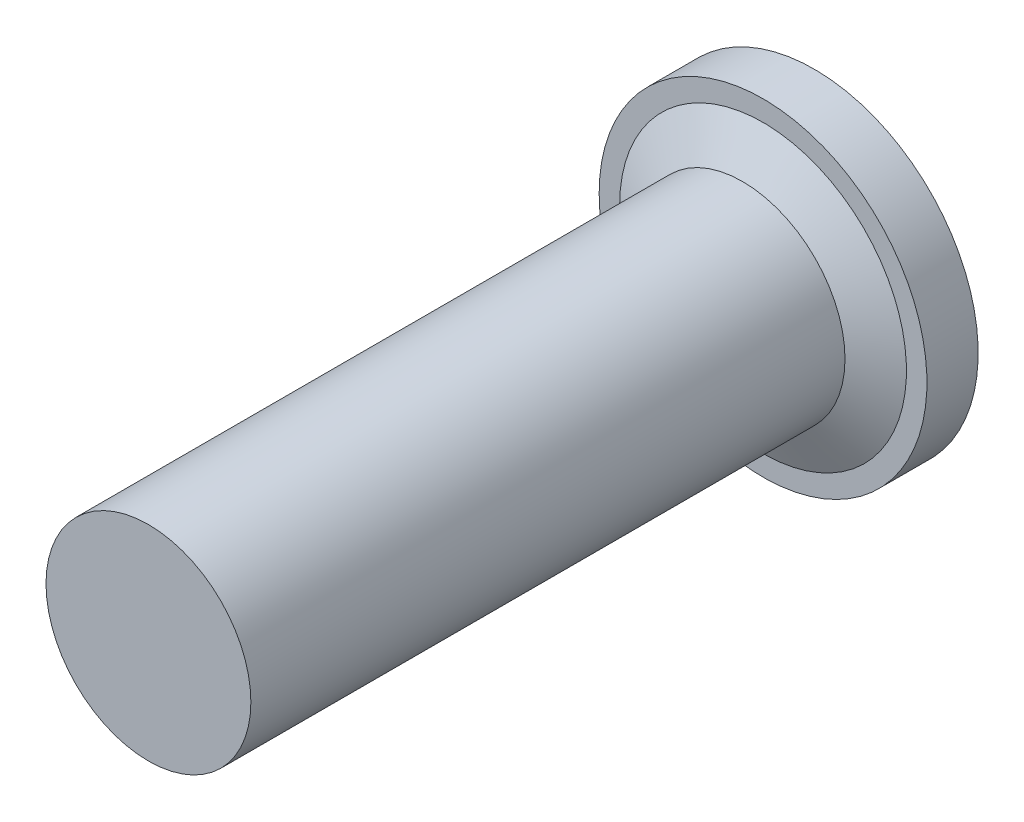
ISO-10303-21;
HEADER;
FILE_DESCRIPTION(('STEP AP214'),'2;1');
FILE_NAME('part.step','',(''),(''),'','','');
FILE_SCHEMA(('AUTOMOTIVE_DESIGN { 1 0 10303 214 1 1 1 1 }'));
ENDSEC;
DATA;
#1=APPLICATION_CONTEXT('core data for automotive mechanical design processes');
#2=APPLICATION_PROTOCOL_DEFINITION('international standard','automotive_design',2000,#1);
#3=PRODUCT_CONTEXT('',#1,'mechanical');
#4=PRODUCT('Part','Part','',(#3));
#5=PRODUCT_RELATED_PRODUCT_CATEGORY('part','',(#4));
#6=PRODUCT_DEFINITION_FORMATION('','',#4);
#7=PRODUCT_DEFINITION_CONTEXT('part definition',#1,'design');
#8=PRODUCT_DEFINITION('design','',#6,#7);
#9=PRODUCT_DEFINITION_SHAPE('','',#8);
#10=(LENGTH_UNIT() NAMED_UNIT(*) SI_UNIT(.MILLI.,.METRE.));
#11=(NAMED_UNIT(*) PLANE_ANGLE_UNIT() SI_UNIT($,.RADIAN.));
#12=(NAMED_UNIT(*) SI_UNIT($,.STERADIAN.) SOLID_ANGLE_UNIT());
#13=UNCERTAINTY_MEASURE_WITH_UNIT(LENGTH_MEASURE(1.E-05),#10,'distance_accuracy_value','');
#14=(GEOMETRIC_REPRESENTATION_CONTEXT(3) GLOBAL_UNCERTAINTY_ASSIGNED_CONTEXT((#13)) GLOBAL_UNIT_ASSIGNED_CONTEXT((#10,
#11,#12)) REPRESENTATION_CONTEXT('',''));
#15=CARTESIAN_POINT('',(0.,0.,0.));
#16=DIRECTION('',(0.,0.,1.));
#17=DIRECTION('',(1.,0.,0.));
#18=AXIS2_PLACEMENT_3D('',#15,#16,#17);
#19=CARTESIAN_POINT('',(0.,0.,-300.906470220889));
#20=DIRECTION('',(0.,0.,1.));
#21=DIRECTION('',(1.,0.,0.));
#22=AXIS2_PLACEMENT_3D('',#19,#20,#21);
#23=PLANE('',#22);
#24=CARTESIAN_POINT('',(0.,0.,-300.906470220889));
#25=DIRECTION('',(0.,0.,-1.));
#26=DIRECTION('',(-1.,0.,0.));
#27=AXIS2_PLACEMENT_3D('',#24,#25,#26);
#28=CIRCLE('',#27,203.2);
#29=CARTESIAN_POINT('',(-203.2,0.,-300.906470220889));
#30=VERTEX_POINT('',#29);
#31=EDGE_CURVE('E10',#30,#30,#28,.T.);
#32=ORIENTED_EDGE('',*,*,#31,.T.);
#33=EDGE_LOOP('',(#32));
#34=FACE_BOUND('',#33,.T.);
#35=ADVANCED_FACE('F40',(#34),#23,.F.);
#36=CARTESIAN_POINT('',(0.,0.,-338.816637037138));
#37=DIRECTION('',(0.,0.,-1.));
#38=DIRECTION('',(-1.,0.,0.));
#39=AXIS2_PLACEMENT_3D('',#36,#37,#38);
#40=CYLINDRICAL_SURFACE('',#39,203.2);
#41=ORIENTED_EDGE('',*,*,#31,.F.);
#42=EDGE_LOOP('',(#41));
#43=FACE_BOUND('',#42,.T.);
#44=CARTESIAN_POINT('',(0.,0.,-237.406470220889));
#45=DIRECTION('',(0.,0.,-1.));
#46=DIRECTION('',(-1.,0.,0.));
#47=AXIS2_PLACEMENT_3D('',#44,#45,#46);
#48=CIRCLE('',#47,203.2);
#49=CARTESIAN_POINT('',(-203.2,0.,-237.406470220889));
#50=VERTEX_POINT('',#49);
#51=EDGE_CURVE('E43',#50,#50,#48,.T.);
#52=ORIENTED_EDGE('',*,*,#51,.T.);
#53=EDGE_LOOP('',(#52));
#54=FACE_BOUND('',#53,.T.);
#55=ADVANCED_FACE('F74',(#43,#54),#40,.T.);
#56=CARTESIAN_POINT('',(203.2,0.,-237.406470220889));
#57=DIRECTION('',(0.,0.,-1.));
#58=DIRECTION('',(-1.,0.,0.));
#59=AXIS2_PLACEMENT_3D('',#56,#57,#58);
#60=PLANE('',#59);
#61=ORIENTED_EDGE('',*,*,#51,.F.);
#62=EDGE_LOOP('',(#61));
#63=FACE_BOUND('',#62,.T.);
#64=CARTESIAN_POINT('',(0.,0.,-237.406470220889));
#65=DIRECTION('',(0.,0.,-1.));
#66=DIRECTION('',(-1.,0.,0.));
#67=AXIS2_PLACEMENT_3D('',#64,#65,#66);
#68=CIRCLE('',#67,177.8);
#69=CARTESIAN_POINT('',(-177.8,0.,-237.406470220889));
#70=VERTEX_POINT('',#69);
#71=EDGE_CURVE('E50',#70,#70,#68,.T.);
#72=ORIENTED_EDGE('',*,*,#71,.T.);
#73=EDGE_LOOP('',(#72));
#74=FACE_BOUND('',#73,.T.);
#75=ADVANCED_FACE('F78',(#63,#74),#60,.F.);
#76=CARTESIAN_POINT('',(0.,0.,-212.006470220889));
#77=DIRECTION('',(0.,0.,-1.));
#78=DIRECTION('',(-1.,0.,0.));
#79=AXIS2_PLACEMENT_3D('',#76,#77,#78);
#80=CONICAL_SURFACE('',#79,127.,1.10714871779409);
#81=ORIENTED_EDGE('',*,*,#71,.F.);
#82=EDGE_LOOP('',(#81));
#83=FACE_BOUND('',#82,.T.);
#84=CARTESIAN_POINT('',(0.,0.,-212.006470220889));
#85=DIRECTION('',(0.,0.,-1.));
#86=DIRECTION('',(-1.,0.,0.));
#87=AXIS2_PLACEMENT_3D('',#84,#85,#86);
#88=CIRCLE('',#87,127.);
#89=CARTESIAN_POINT('',(-127.,0.,-212.006470220889));
#90=VERTEX_POINT('',#89);
#91=EDGE_CURVE('E51',#90,#90,#88,.T.);
#92=ORIENTED_EDGE('',*,*,#91,.T.);
#93=EDGE_LOOP('',(#92));
#94=FACE_BOUND('',#93,.T.);
#95=ADVANCED_FACE('F66',(#83,#94),#80,.T.);
#96=CARTESIAN_POINT('',(0.,0.,-338.816637037138));
#97=DIRECTION('',(0.,0.,-1.));
#98=DIRECTION('',(-1.,0.,0.));
#99=AXIS2_PLACEMENT_3D('',#96,#97,#98);
#100=CYLINDRICAL_SURFACE('',#99,127.);
#101=ORIENTED_EDGE('',*,*,#91,.F.);
#102=EDGE_LOOP('',(#101));
#103=FACE_BOUND('',#102,.T.);
#104=CARTESIAN_POINT('',(0.,0.,524.593529779111));
#105=DIRECTION('',(0.,0.,-1.));
#106=DIRECTION('',(-1.,0.,0.));
#107=AXIS2_PLACEMENT_3D('',#104,#105,#106);
#108=CIRCLE('',#107,127.);
#109=CARTESIAN_POINT('',(-127.,0.,524.593529779111));
#110=VERTEX_POINT('',#109);
#111=EDGE_CURVE('E57',#110,#110,#108,.T.);
#112=ORIENTED_EDGE('',*,*,#111,.T.);
#113=EDGE_LOOP('',(#112));
#114=FACE_BOUND('',#113,.T.);
#115=ADVANCED_FACE('F58',(#103,#114),#100,.T.);
#116=CARTESIAN_POINT('',(127.,0.,524.593529779111));
#117=DIRECTION('',(0.,0.,-1.));
#118=DIRECTION('',(-1.,0.,0.));
#119=AXIS2_PLACEMENT_3D('',#116,#117,#118);
#120=PLANE('',#119);
#121=ORIENTED_EDGE('',*,*,#111,.F.);
#122=EDGE_LOOP('',(#121));
#123=FACE_BOUND('',#122,.T.);
#124=ADVANCED_FACE('F64',(#123),#120,.F.);
#125=CLOSED_SHELL('',(#35,#55,#75,#95,#115,#124));
#126=MANIFOLD_SOLID_BREP('B2',#125);
#127=ADVANCED_BREP_SHAPE_REPRESENTATION('',(#18,#126),#14);
#128=SHAPE_DEFINITION_REPRESENTATION(#9,#127);
ENDSEC;
END-ISO-10303-21;
